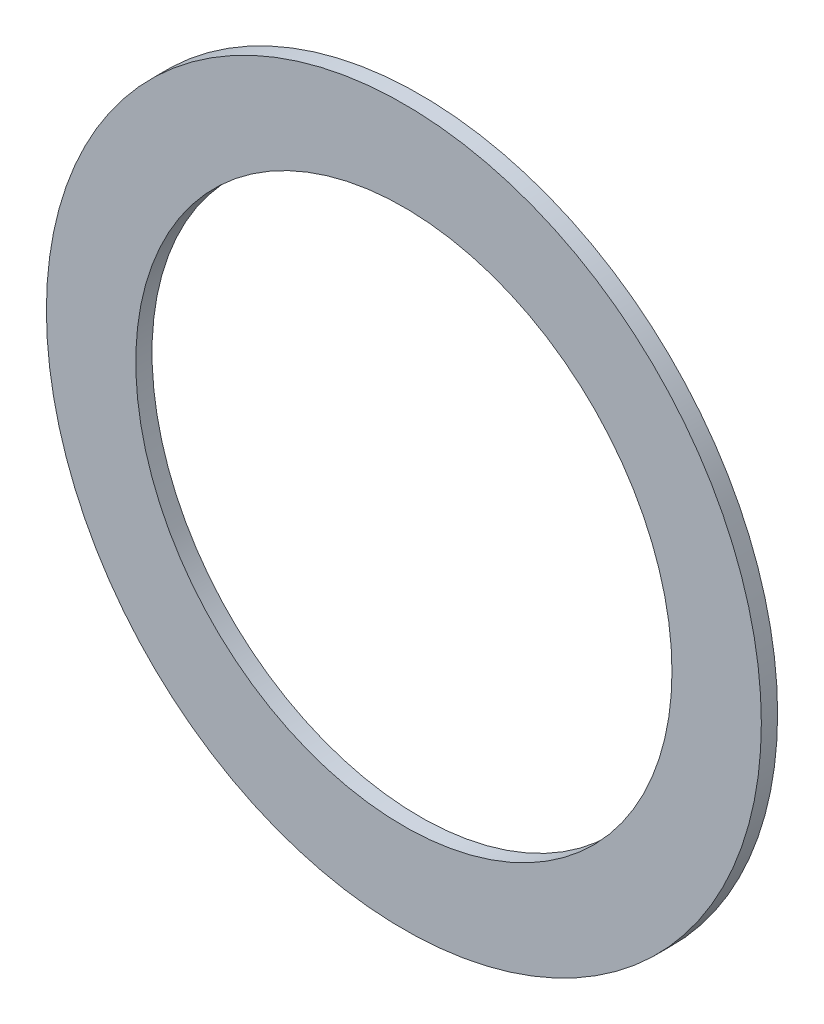
ISO-10303-21;
HEADER;
FILE_DESCRIPTION(('STEP AP214'),'2;1');
FILE_NAME('part.step','',(''),(''),'','','');
FILE_SCHEMA(('AUTOMOTIVE_DESIGN { 1 0 10303 214 1 1 1 1 }'));
ENDSEC;
DATA;
#1=APPLICATION_CONTEXT('core data for automotive mechanical design processes');
#2=APPLICATION_PROTOCOL_DEFINITION('international standard','automotive_design',2000,#1);
#3=PRODUCT_CONTEXT('',#1,'mechanical');
#4=PRODUCT('Part','Part','',(#3));
#5=PRODUCT_RELATED_PRODUCT_CATEGORY('part','',(#4));
#6=PRODUCT_DEFINITION_FORMATION('','',#4);
#7=PRODUCT_DEFINITION_CONTEXT('part definition',#1,'design');
#8=PRODUCT_DEFINITION('design','',#6,#7);
#9=PRODUCT_DEFINITION_SHAPE('','',#8);
#10=(LENGTH_UNIT() NAMED_UNIT(*) SI_UNIT(.MILLI.,.METRE.));
#11=(NAMED_UNIT(*) PLANE_ANGLE_UNIT() SI_UNIT($,.RADIAN.));
#12=(NAMED_UNIT(*) SI_UNIT($,.STERADIAN.) SOLID_ANGLE_UNIT());
#13=UNCERTAINTY_MEASURE_WITH_UNIT(LENGTH_MEASURE(1.E-05),#10,'distance_accuracy_value','');
#14=(GEOMETRIC_REPRESENTATION_CONTEXT(3) GLOBAL_UNCERTAINTY_ASSIGNED_CONTEXT((#13)) GLOBAL_UNIT_ASSIGNED_CONTEXT((#10,
#11,#12)) REPRESENTATION_CONTEXT('',''));
#15=CARTESIAN_POINT('',(0.,0.,0.));
#16=DIRECTION('',(0.,0.,1.));
#17=DIRECTION('',(1.,0.,0.));
#18=AXIS2_PLACEMENT_3D('',#15,#16,#17);
#19=CARTESIAN_POINT('',(0.,0.,-0.0001));
#20=DIRECTION('',(0.,0.,1.));
#21=DIRECTION('',(1.,0.,0.));
#22=AXIS2_PLACEMENT_3D('',#19,#20,#21);
#23=CYLINDRICAL_SURFACE('',#22,11.);
#24=CARTESIAN_POINT('',(0.,0.,-0.0001));
#25=DIRECTION('',(0.,0.,1.));
#26=DIRECTION('',(1.,0.,0.));
#27=AXIS2_PLACEMENT_3D('',#24,#25,#26);
#28=CIRCLE('',#27,11.);
#29=CARTESIAN_POINT('',(11.,0.,-0.0001));
#30=VERTEX_POINT('',#29);
#31=EDGE_CURVE('E10',#30,#30,#28,.T.);
#32=ORIENTED_EDGE('',*,*,#31,.T.);
#33=EDGE_LOOP('',(#32));
#34=FACE_BOUND('',#33,.T.);
#35=CARTESIAN_POINT('',(0.,0.,0.5));
#36=DIRECTION('',(0.,0.,1.));
#37=DIRECTION('',(1.,0.,0.));
#38=AXIS2_PLACEMENT_3D('',#35,#36,#37);
#39=CIRCLE('',#38,11.);
#40=CARTESIAN_POINT('',(11.,0.,0.5));
#41=VERTEX_POINT('',#40);
#42=EDGE_CURVE('E40',#41,#41,#39,.T.);
#43=ORIENTED_EDGE('',*,*,#42,.F.);
#44=EDGE_LOOP('',(#43));
#45=FACE_BOUND('',#44,.T.);
#46=ADVANCED_FACE('F30',(#34,#45),#23,.T.);
#47=CARTESIAN_POINT('',(0.,0.,-0.0001));
#48=DIRECTION('',(0.,0.,1.));
#49=DIRECTION('',(1.,0.,0.));
#50=AXIS2_PLACEMENT_3D('',#47,#48,#49);
#51=PLANE('',#50);
#52=CARTESIAN_POINT('',(0.,0.,-0.0001));
#53=DIRECTION('',(0.,0.,1.));
#54=DIRECTION('',(1.,0.,0.));
#55=AXIS2_PLACEMENT_3D('',#52,#53,#54);
#56=CIRCLE('',#55,8.25);
#57=CARTESIAN_POINT('',(8.25,0.,-0.0001));
#58=VERTEX_POINT('',#57);
#59=EDGE_CURVE('E36',#58,#58,#56,.T.);
#60=ORIENTED_EDGE('',*,*,#59,.T.);
#61=EDGE_LOOP('',(#60));
#62=FACE_BOUND('',#61,.T.);
#63=ORIENTED_EDGE('',*,*,#31,.F.);
#64=EDGE_LOOP('',(#63));
#65=FACE_BOUND('',#64,.T.);
#66=ADVANCED_FACE('F59',(#62,#65),#51,.F.);
#67=CARTESIAN_POINT('',(0.,0.,-0.0001));
#68=DIRECTION('',(0.,0.,1.));
#69=DIRECTION('',(1.,0.,0.));
#70=AXIS2_PLACEMENT_3D('',#67,#68,#69);
#71=CYLINDRICAL_SURFACE('',#70,8.25);
#72=ORIENTED_EDGE('',*,*,#59,.F.);
#73=EDGE_LOOP('',(#72));
#74=FACE_BOUND('',#73,.T.);
#75=CARTESIAN_POINT('',(0.,0.,0.5));
#76=DIRECTION('',(0.,0.,1.));
#77=DIRECTION('',(1.,0.,0.));
#78=AXIS2_PLACEMENT_3D('',#75,#76,#77);
#79=CIRCLE('',#78,8.25);
#80=CARTESIAN_POINT('',(8.25,0.,0.5));
#81=VERTEX_POINT('',#80);
#82=EDGE_CURVE('E44',#81,#81,#79,.T.);
#83=ORIENTED_EDGE('',*,*,#82,.T.);
#84=EDGE_LOOP('',(#83));
#85=FACE_BOUND('',#84,.T.);
#86=ADVANCED_FACE('F50',(#74,#85),#71,.F.);
#87=CARTESIAN_POINT('',(0.,0.,0.5));
#88=DIRECTION('',(0.,0.,1.));
#89=DIRECTION('',(1.,0.,0.));
#90=AXIS2_PLACEMENT_3D('',#87,#88,#89);
#91=PLANE('',#90);
#92=ORIENTED_EDGE('',*,*,#42,.T.);
#93=EDGE_LOOP('',(#92));
#94=FACE_BOUND('',#93,.T.);
#95=ORIENTED_EDGE('',*,*,#82,.F.);
#96=EDGE_LOOP('',(#95));
#97=FACE_BOUND('',#96,.T.);
#98=ADVANCED_FACE('F52',(#94,#97),#91,.T.);
#99=CLOSED_SHELL('',(#46,#66,#86,#98));
#100=MANIFOLD_SOLID_BREP('B2',#99);
#101=ADVANCED_BREP_SHAPE_REPRESENTATION('',(#18,#100),#14);
#102=SHAPE_DEFINITION_REPRESENTATION(#9,#101);
ENDSEC;
END-ISO-10303-21;
